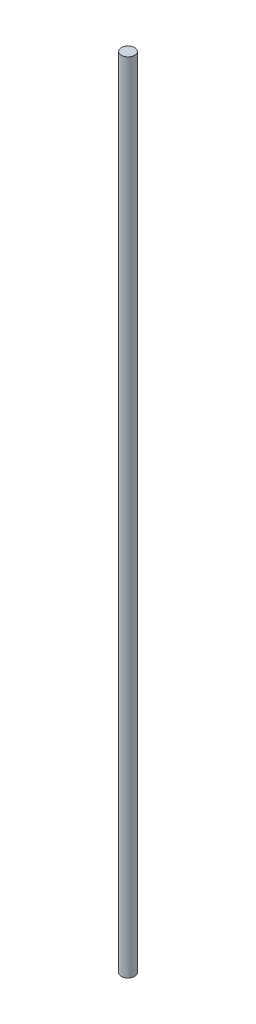
ISO-10303-21;
HEADER;
FILE_DESCRIPTION(('STEP AP214'),'2;1');
FILE_NAME('part.step','',(''),(''),'','','');
FILE_SCHEMA(('AUTOMOTIVE_DESIGN { 1 0 10303 214 1 1 1 1 }'));
ENDSEC;
DATA;
#1=APPLICATION_CONTEXT('core data for automotive mechanical design processes');
#2=APPLICATION_PROTOCOL_DEFINITION('international standard','automotive_design',2000,#1);
#3=PRODUCT_CONTEXT('',#1,'mechanical');
#4=PRODUCT('Part','Part','',(#3));
#5=PRODUCT_RELATED_PRODUCT_CATEGORY('part','',(#4));
#6=PRODUCT_DEFINITION_FORMATION('','',#4);
#7=PRODUCT_DEFINITION_CONTEXT('part definition',#1,'design');
#8=PRODUCT_DEFINITION('design','',#6,#7);
#9=PRODUCT_DEFINITION_SHAPE('','',#8);
#10=(LENGTH_UNIT() NAMED_UNIT(*) SI_UNIT(.MILLI.,.METRE.));
#11=(NAMED_UNIT(*) PLANE_ANGLE_UNIT() SI_UNIT($,.RADIAN.));
#12=(NAMED_UNIT(*) SI_UNIT($,.STERADIAN.) SOLID_ANGLE_UNIT());
#13=UNCERTAINTY_MEASURE_WITH_UNIT(LENGTH_MEASURE(1.E-05),#10,'distance_accuracy_value','');
#14=(GEOMETRIC_REPRESENTATION_CONTEXT(3) GLOBAL_UNCERTAINTY_ASSIGNED_CONTEXT((#13)) GLOBAL_UNIT_ASSIGNED_CONTEXT((#10,
#11,#12)) REPRESENTATION_CONTEXT('',''));
#15=CARTESIAN_POINT('',(0.,0.,0.));
#16=DIRECTION('',(0.,0.,1.));
#17=DIRECTION('',(1.,0.,0.));
#18=AXIS2_PLACEMENT_3D('',#15,#16,#17);
#19=CARTESIAN_POINT('',(0.,480.,0.));
#20=DIRECTION('',(0.,-1.,0.));
#21=DIRECTION('',(0.,0.,-1.));
#22=AXIS2_PLACEMENT_3D('',#19,#20,#21);
#23=CYLINDRICAL_SURFACE('',#22,4.);
#24=CARTESIAN_POINT('',(0.,480.,0.));
#25=DIRECTION('',(0.,1.,0.));
#26=DIRECTION('',(0.,0.,1.));
#27=AXIS2_PLACEMENT_3D('',#24,#25,#26);
#28=CIRCLE('',#27,4.);
#29=CARTESIAN_POINT('',(0.,480.,4.));
#30=VERTEX_POINT('',#29);
#31=EDGE_CURVE('E10',#30,#30,#28,.T.);
#32=ORIENTED_EDGE('',*,*,#31,.F.);
#33=EDGE_LOOP('',(#32));
#34=FACE_BOUND('',#33,.T.);
#35=CARTESIAN_POINT('',(0.,0.,0.));
#36=DIRECTION('',(0.,1.,0.));
#37=DIRECTION('',(0.,0.,1.));
#38=AXIS2_PLACEMENT_3D('',#35,#36,#37);
#39=CIRCLE('',#38,4.);
#40=CARTESIAN_POINT('',(0.,0.,4.));
#41=VERTEX_POINT('',#40);
#42=EDGE_CURVE('E42',#41,#41,#39,.T.);
#43=ORIENTED_EDGE('',*,*,#42,.T.);
#44=EDGE_LOOP('',(#43));
#45=FACE_BOUND('',#44,.T.);
#46=ADVANCED_FACE('F41',(#34,#45),#23,.T.);
#47=CARTESIAN_POINT('',(0.,480.,0.));
#48=DIRECTION('',(0.,1.,0.));
#49=DIRECTION('',(0.,0.,1.));
#50=AXIS2_PLACEMENT_3D('',#47,#48,#49);
#51=PLANE('',#50);
#52=ORIENTED_EDGE('',*,*,#31,.T.);
#53=EDGE_LOOP('',(#52));
#54=FACE_BOUND('',#53,.T.);
#55=ADVANCED_FACE('F57',(#54),#51,.T.);
#56=CARTESIAN_POINT('',(0.,0.,0.));
#57=DIRECTION('',(0.,1.,0.));
#58=DIRECTION('',(0.,0.,1.));
#59=AXIS2_PLACEMENT_3D('',#56,#57,#58);
#60=PLANE('',#59);
#61=ORIENTED_EDGE('',*,*,#42,.F.);
#62=EDGE_LOOP('',(#61));
#63=FACE_BOUND('',#62,.T.);
#64=ADVANCED_FACE('F53',(#63),#60,.F.);
#65=CLOSED_SHELL('',(#46,#55,#64));
#66=MANIFOLD_SOLID_BREP('B2',#65);
#67=ADVANCED_BREP_SHAPE_REPRESENTATION('',(#18,#66),#14);
#68=SHAPE_DEFINITION_REPRESENTATION(#9,#67);
ENDSEC;
END-ISO-10303-21;
